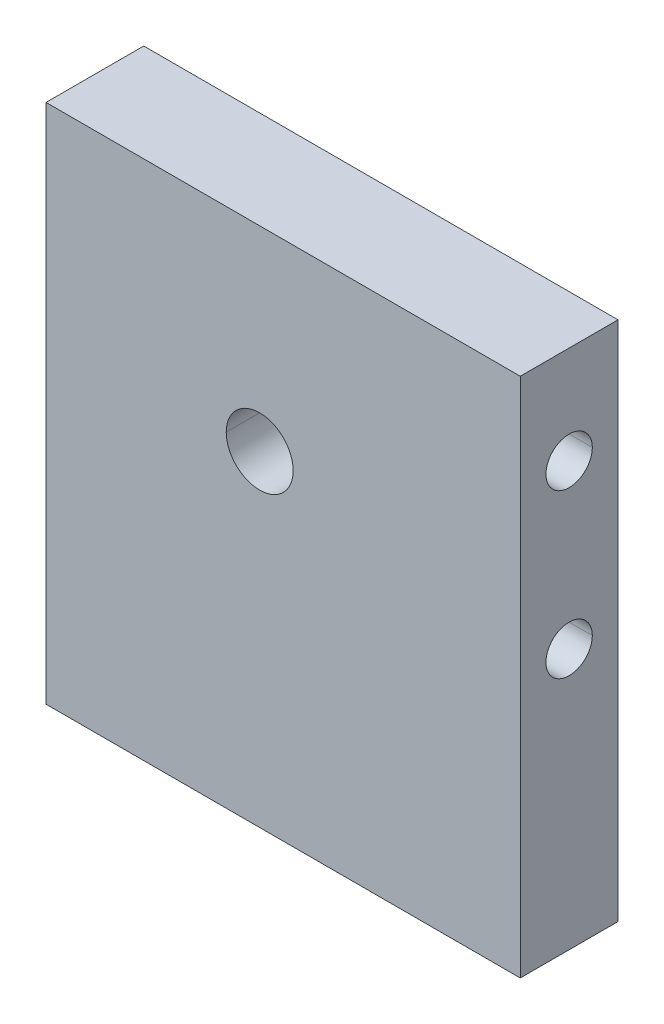
ISO-10303-21;
HEADER;
FILE_DESCRIPTION(('STEP AP214'),'2;1');
FILE_NAME('part.step','',(''),(''),'','','');
FILE_SCHEMA(('AUTOMOTIVE_DESIGN { 1 0 10303 214 1 1 1 1 }'));
ENDSEC;
DATA;
#1=APPLICATION_CONTEXT('core data for automotive mechanical design processes');
#2=APPLICATION_PROTOCOL_DEFINITION('international standard','automotive_design',2000,#1);
#3=PRODUCT_CONTEXT('',#1,'mechanical');
#4=PRODUCT('Part','Part','',(#3));
#5=PRODUCT_RELATED_PRODUCT_CATEGORY('part','',(#4));
#6=PRODUCT_DEFINITION_FORMATION('','',#4);
#7=PRODUCT_DEFINITION_CONTEXT('part definition',#1,'design');
#8=PRODUCT_DEFINITION('design','',#6,#7);
#9=PRODUCT_DEFINITION_SHAPE('','',#8);
#10=(LENGTH_UNIT() NAMED_UNIT(*) SI_UNIT(.MILLI.,.METRE.));
#11=(NAMED_UNIT(*) PLANE_ANGLE_UNIT() SI_UNIT($,.RADIAN.));
#12=(NAMED_UNIT(*) SI_UNIT($,.STERADIAN.) SOLID_ANGLE_UNIT());
#13=UNCERTAINTY_MEASURE_WITH_UNIT(LENGTH_MEASURE(1.E-05),#10,'distance_accuracy_value','');
#14=(GEOMETRIC_REPRESENTATION_CONTEXT(3) GLOBAL_UNCERTAINTY_ASSIGNED_CONTEXT((#13)) GLOBAL_UNIT_ASSIGNED_CONTEXT((#10,
#11,#12)) REPRESENTATION_CONTEXT('',''));
#15=CARTESIAN_POINT('',(0.,0.,0.));
#16=DIRECTION('',(0.,0.,1.));
#17=DIRECTION('',(1.,0.,0.));
#18=AXIS2_PLACEMENT_3D('',#15,#16,#17);
#19=CARTESIAN_POINT('',(11.557,20.6375,2.38125));
#20=DIRECTION('',(1.,0.,0.));
#21=DIRECTION('',(0.,0.,-1.));
#22=AXIS2_PLACEMENT_3D('',#19,#20,#21);
#23=CYLINDRICAL_SURFACE('',#22,1.1303);
#24=CARTESIAN_POINT('',(2.032,20.6375,2.38125));
#25=DIRECTION('',(1.,0.,0.));
#26=DIRECTION('',(0.,0.,-1.));
#27=AXIS2_PLACEMENT_3D('',#24,#25,#26);
#28=CIRCLE('',#27,1.1303);
#29=CARTESIAN_POINT('',(2.032,20.6375,3.51155));
#30=VERTEX_POINT('',#29);
#31=CARTESIAN_POINT('',(2.032,20.6375,1.25095));
#32=VERTEX_POINT('',#31);
#33=EDGE_CURVE('E42',#30,#32,#28,.T.);
#34=ORIENTED_EDGE('',*,*,#33,.F.);
#35=DIRECTION('',(1.,0.,0.));
#36=VECTOR('',#35,1.);
#37=CARTESIAN_POINT('',(11.557,20.6375,3.51155));
#38=LINE('',#37,#36);
#39=CARTESIAN_POINT('',(11.557,20.6375,3.51155));
#40=VERTEX_POINT('',#39);
#41=EDGE_CURVE('E11',#30,#40,#38,.T.);
#42=ORIENTED_EDGE('',*,*,#41,.T.);
#43=CARTESIAN_POINT('',(11.557,20.6375,2.38125));
#44=DIRECTION('',(1.,0.,0.));
#45=DIRECTION('',(0.,0.,-1.));
#46=AXIS2_PLACEMENT_3D('',#43,#44,#45);
#47=CIRCLE('',#46,1.1303);
#48=CARTESIAN_POINT('',(11.557,20.6375,1.25095));
#49=VERTEX_POINT('',#48);
#50=EDGE_CURVE('E28',#40,#49,#47,.T.);
#51=ORIENTED_EDGE('',*,*,#50,.T.);
#52=DIRECTION('',(1.,0.,0.));
#53=VECTOR('',#52,1.);
#54=CARTESIAN_POINT('',(11.557,20.6375,1.25095));
#55=LINE('',#54,#53);
#56=EDGE_CURVE('E158',#32,#49,#55,.T.);
#57=ORIENTED_EDGE('',*,*,#56,.F.);
#58=EDGE_LOOP('',(#34,#42,#51,#57));
#59=FACE_BOUND('',#58,.T.);
#60=ADVANCED_FACE('F17',(#59),#23,.F.);
#61=CARTESIAN_POINT('',(2.032,20.6375,2.38125));
#62=DIRECTION('',(1.,0.,0.));
#63=DIRECTION('',(0.,0.,-1.));
#64=AXIS2_PLACEMENT_3D('',#61,#62,#63);
#65=CONICAL_SURFACE('',#64,1.1303,1.02974425867665);
#66=DIRECTION('',(0.515038074910056,0.,-0.857167300702111));
#67=VECTOR('',#66,1.);
#68=CARTESIAN_POINT('',(2.032,20.6375,1.25095));
#69=LINE('',#68,#67);
#70=CARTESIAN_POINT('',(1.35284724231315,20.6375,2.38125));
#71=VERTEX_POINT('',#70);
#72=EDGE_CURVE('E144',#71,#32,#69,.T.);
#73=ORIENTED_EDGE('',*,*,#72,.F.);
#74=DIRECTION('',(0.515038074910056,0.,0.857167300702111));
#75=VECTOR('',#74,1.);
#76=CARTESIAN_POINT('',(2.032,20.6375,3.51155));
#77=LINE('',#76,#75);
#78=EDGE_CURVE('E168',#71,#30,#77,.T.);
#79=ORIENTED_EDGE('',*,*,#78,.T.);
#80=ORIENTED_EDGE('',*,*,#33,.T.);
#81=EDGE_LOOP('',(#73,#79,#80));
#82=FACE_BOUND('',#81,.T.);
#83=ADVANCED_FACE('F220',(#82),#65,.F.);
#84=CARTESIAN_POINT('',(11.557,12.7,2.38125));
#85=DIRECTION('',(1.,0.,0.));
#86=DIRECTION('',(0.,0.,-1.));
#87=AXIS2_PLACEMENT_3D('',#84,#85,#86);
#88=CYLINDRICAL_SURFACE('',#87,1.1303);
#89=CARTESIAN_POINT('',(2.032,12.7,2.38125));
#90=DIRECTION('',(1.,0.,0.));
#91=DIRECTION('',(0.,0.,-1.));
#92=AXIS2_PLACEMENT_3D('',#89,#90,#91);
#93=CIRCLE('',#92,1.1303);
#94=CARTESIAN_POINT('',(2.032,12.7,3.51155));
#95=VERTEX_POINT('',#94);
#96=CARTESIAN_POINT('',(2.032,12.7,1.25095));
#97=VERTEX_POINT('',#96);
#98=EDGE_CURVE('E120',#95,#97,#93,.T.);
#99=ORIENTED_EDGE('',*,*,#98,.F.);
#100=DIRECTION('',(1.,0.,0.));
#101=VECTOR('',#100,1.);
#102=CARTESIAN_POINT('',(11.557,12.7,3.51155));
#103=LINE('',#102,#101);
#104=CARTESIAN_POINT('',(11.557,12.7,3.51155));
#105=VERTEX_POINT('',#104);
#106=EDGE_CURVE('E136',#95,#105,#103,.T.);
#107=ORIENTED_EDGE('',*,*,#106,.T.);
#108=CARTESIAN_POINT('',(11.557,12.7,2.38125));
#109=DIRECTION('',(1.,0.,0.));
#110=DIRECTION('',(0.,0.,-1.));
#111=AXIS2_PLACEMENT_3D('',#108,#109,#110);
#112=CIRCLE('',#111,1.1303);
#113=CARTESIAN_POINT('',(11.557,12.7,1.25095));
#114=VERTEX_POINT('',#113);
#115=EDGE_CURVE('E130',#105,#114,#112,.T.);
#116=ORIENTED_EDGE('',*,*,#115,.T.);
#117=DIRECTION('',(1.,0.,0.));
#118=VECTOR('',#117,1.);
#119=CARTESIAN_POINT('',(11.557,12.7,1.25095));
#120=LINE('',#119,#118);
#121=EDGE_CURVE('E105',#97,#114,#120,.T.);
#122=ORIENTED_EDGE('',*,*,#121,.F.);
#123=EDGE_LOOP('',(#99,#107,#116,#122));
#124=FACE_BOUND('',#123,.T.);
#125=ADVANCED_FACE('F247',(#124),#88,.F.);
#126=CARTESIAN_POINT('',(2.032,12.7,2.38125));
#127=DIRECTION('',(1.,0.,0.));
#128=DIRECTION('',(0.,0.,-1.));
#129=AXIS2_PLACEMENT_3D('',#126,#127,#128);
#130=CONICAL_SURFACE('',#129,1.1303,1.02974425867665);
#131=DIRECTION('',(0.515038074910056,0.,-0.857167300702111));
#132=VECTOR('',#131,1.);
#133=CARTESIAN_POINT('',(2.032,12.7,1.25095));
#134=LINE('',#133,#132);
#135=CARTESIAN_POINT('',(1.35284724231315,12.7,2.38125));
#136=VERTEX_POINT('',#135);
#137=EDGE_CURVE('E115',#136,#97,#134,.T.);
#138=ORIENTED_EDGE('',*,*,#137,.F.);
#139=DIRECTION('',(0.515038074910056,0.,0.857167300702111));
#140=VECTOR('',#139,1.);
#141=CARTESIAN_POINT('',(2.032,12.7,3.51155));
#142=LINE('',#141,#140);
#143=EDGE_CURVE('E118',#136,#95,#142,.T.);
#144=ORIENTED_EDGE('',*,*,#143,.T.);
#145=ORIENTED_EDGE('',*,*,#98,.T.);
#146=EDGE_LOOP('',(#138,#144,#145));
#147=FACE_BOUND('',#146,.T.);
#148=ADVANCED_FACE('F117',(#147),#130,.F.);
#149=CARTESIAN_POINT('',(-1.14299999999998,15.875,0.));
#150=DIRECTION('',(0.,0.,-1.));
#151=DIRECTION('',(-1.,0.,0.));
#152=AXIS2_PLACEMENT_3D('',#149,#150,#151);
#153=CYLINDRICAL_SURFACE('',#152,1.63195);
#154=CARTESIAN_POINT('',(-1.14299999999998,15.875,4.7625));
#155=DIRECTION('',(0.,0.,-1.));
#156=DIRECTION('',(-1.,0.,0.));
#157=AXIS2_PLACEMENT_3D('',#154,#155,#156);
#158=CIRCLE('',#157,1.63195);
#159=CARTESIAN_POINT('',(0.488950000000019,15.875,4.7625));
#160=VERTEX_POINT('',#159);
#161=CARTESIAN_POINT('',(-2.77495,15.875,4.7625));
#162=VERTEX_POINT('',#161);
#163=EDGE_CURVE('E175',#160,#162,#158,.T.);
#164=ORIENTED_EDGE('',*,*,#163,.F.);
#165=DIRECTION('',(0.,0.,-1.));
#166=VECTOR('',#165,1.);
#167=CARTESIAN_POINT('',(0.488950000000018,15.875,0.));
#168=LINE('',#167,#166);
#169=CARTESIAN_POINT('',(0.488950000000016,15.875,0.));
#170=VERTEX_POINT('',#169);
#171=EDGE_CURVE('E139',#160,#170,#168,.T.);
#172=ORIENTED_EDGE('',*,*,#171,.T.);
#173=CARTESIAN_POINT('',(-1.14299999999998,15.875,0.));
#174=DIRECTION('',(0.,0.,-1.));
#175=DIRECTION('',(-1.,0.,0.));
#176=AXIS2_PLACEMENT_3D('',#173,#174,#175);
#177=CIRCLE('',#176,1.63195);
#178=CARTESIAN_POINT('',(-2.77495,15.875,0.));
#179=VERTEX_POINT('',#178);
#180=EDGE_CURVE('E186',#170,#179,#177,.T.);
#181=ORIENTED_EDGE('',*,*,#180,.T.);
#182=DIRECTION('',(0.,0.,-1.));
#183=VECTOR('',#182,1.);
#184=CARTESIAN_POINT('',(-2.77495,15.875,0.));
#185=LINE('',#184,#183);
#186=EDGE_CURVE('E180',#162,#179,#185,.T.);
#187=ORIENTED_EDGE('',*,*,#186,.F.);
#188=EDGE_LOOP('',(#164,#172,#181,#187));
#189=FACE_BOUND('',#188,.T.);
#190=ADVANCED_FACE('F255',(#189),#153,.F.);
#191=CARTESIAN_POINT('',(-11.557,0.,4.7625));
#192=DIRECTION('',(1.,0.,0.));
#193=DIRECTION('',(0.,-1.,0.));
#194=AXIS2_PLACEMENT_3D('',#191,#192,#193);
#195=PLANE('',#194);
#196=DIRECTION('',(0.,-1.,0.));
#197=VECTOR('',#196,1.);
#198=CARTESIAN_POINT('',(-11.557,0.,0.));
#199=LINE('',#198,#197);
#200=CARTESIAN_POINT('',(-11.557,25.4,0.));
#201=VERTEX_POINT('',#200);
#202=CARTESIAN_POINT('',(-11.557,0.,0.));
#203=VERTEX_POINT('',#202);
#204=EDGE_CURVE('E173',#201,#203,#199,.T.);
#205=ORIENTED_EDGE('',*,*,#204,.T.);
#206=DIRECTION('',(0.,0.,-1.));
#207=VECTOR('',#206,1.);
#208=CARTESIAN_POINT('',(-11.557,0.,4.7625));
#209=LINE('',#208,#207);
#210=CARTESIAN_POINT('',(-11.557,0.,4.7625));
#211=VERTEX_POINT('',#210);
#212=EDGE_CURVE('E207',#211,#203,#209,.T.);
#213=ORIENTED_EDGE('',*,*,#212,.F.);
#214=DIRECTION('',(0.,-1.,0.));
#215=VECTOR('',#214,1.);
#216=CARTESIAN_POINT('',(-11.557,0.,4.7625));
#217=LINE('',#216,#215);
#218=CARTESIAN_POINT('',(-11.557,25.4,4.7625));
#219=VERTEX_POINT('',#218);
#220=EDGE_CURVE('E150',#219,#211,#217,.T.);
#221=ORIENTED_EDGE('',*,*,#220,.F.);
#222=DIRECTION('',(0.,0.,-1.));
#223=VECTOR('',#222,1.);
#224=CARTESIAN_POINT('',(-11.557,25.4,4.7625));
#225=LINE('',#224,#223);
#226=EDGE_CURVE('E170',#219,#201,#225,.T.);
#227=ORIENTED_EDGE('',*,*,#226,.T.);
#228=EDGE_LOOP('',(#205,#213,#221,#227));
#229=FACE_BOUND('',#228,.T.);
#230=ADVANCED_FACE('F330',(#229),#195,.F.);
#231=CARTESIAN_POINT('',(-11.557,0.,4.7625));
#232=DIRECTION('',(0.,1.,0.));
#233=DIRECTION('',(1.,0.,0.));
#234=AXIS2_PLACEMENT_3D('',#231,#232,#233);
#235=PLANE('',#234);
#236=DIRECTION('',(1.,0.,0.));
#237=VECTOR('',#236,1.);
#238=CARTESIAN_POINT('',(-11.557,0.,0.));
#239=LINE('',#238,#237);
#240=CARTESIAN_POINT('',(11.557,0.,0.));
#241=VERTEX_POINT('',#240);
#242=EDGE_CURVE('E174',#203,#241,#239,.T.);
#243=ORIENTED_EDGE('',*,*,#242,.T.);
#244=DIRECTION('',(0.,0.,-1.));
#245=VECTOR('',#244,1.);
#246=CARTESIAN_POINT('',(11.557,0.,4.7625));
#247=LINE('',#246,#245);
#248=CARTESIAN_POINT('',(11.557,0.,4.7625));
#249=VERTEX_POINT('',#248);
#250=EDGE_CURVE('E282',#249,#241,#247,.T.);
#251=ORIENTED_EDGE('',*,*,#250,.F.);
#252=DIRECTION('',(1.,0.,0.));
#253=VECTOR('',#252,1.);
#254=CARTESIAN_POINT('',(-11.557,0.,4.7625));
#255=LINE('',#254,#253);
#256=EDGE_CURVE('E21',#211,#249,#255,.T.);
#257=ORIENTED_EDGE('',*,*,#256,.F.);
#258=ORIENTED_EDGE('',*,*,#212,.T.);
#259=EDGE_LOOP('',(#243,#251,#257,#258));
#260=FACE_BOUND('',#259,.T.);
#261=ADVANCED_FACE('F250',(#260),#235,.F.);
#262=CARTESIAN_POINT('',(11.557,0.,4.7625));
#263=DIRECTION('',(-1.,0.,0.));
#264=DIRECTION('',(0.,0.,1.));
#265=AXIS2_PLACEMENT_3D('',#262,#263,#264);
#266=PLANE('',#265);
#267=DIRECTION('',(0.,1.,0.));
#268=VECTOR('',#267,1.);
#269=CARTESIAN_POINT('',(11.557,0.,0.));
#270=LINE('',#269,#268);
#271=CARTESIAN_POINT('',(11.557,25.4,0.));
#272=VERTEX_POINT('',#271);
#273=EDGE_CURVE('E210',#241,#272,#270,.T.);
#274=ORIENTED_EDGE('',*,*,#273,.T.);
#275=DIRECTION('',(0.,0.,-1.));
#276=VECTOR('',#275,1.);
#277=CARTESIAN_POINT('',(11.557,25.4,4.7625));
#278=LINE('',#277,#276);
#279=CARTESIAN_POINT('',(11.557,25.4,4.7625));
#280=VERTEX_POINT('',#279);
#281=EDGE_CURVE('E154',#280,#272,#278,.T.);
#282=ORIENTED_EDGE('',*,*,#281,.F.);
#283=DIRECTION('',(0.,1.,0.));
#284=VECTOR('',#283,1.);
#285=CARTESIAN_POINT('',(11.557,0.,4.7625));
#286=LINE('',#285,#284);
#287=EDGE_CURVE('E185',#249,#280,#286,.T.);
#288=ORIENTED_EDGE('',*,*,#287,.F.);
#289=ORIENTED_EDGE('',*,*,#250,.T.);
#290=EDGE_LOOP('',(#274,#282,#288,#289));
#291=FACE_BOUND('',#290,.T.);
#292=CARTESIAN_POINT('',(11.557,20.6375,2.38125));
#293=DIRECTION('',(1.,0.,0.));
#294=DIRECTION('',(0.,0.,-1.));
#295=AXIS2_PLACEMENT_3D('',#292,#293,#294);
#296=CIRCLE('',#295,1.1303);
#297=EDGE_CURVE('E162',#49,#40,#296,.T.);
#298=ORIENTED_EDGE('',*,*,#297,.F.);
#299=ORIENTED_EDGE('',*,*,#50,.F.);
#300=EDGE_LOOP('',(#298,#299));
#301=FACE_BOUND('',#300,.T.);
#302=CARTESIAN_POINT('',(11.557,12.7,2.38125));
#303=DIRECTION('',(1.,0.,0.));
#304=DIRECTION('',(0.,0.,-1.));
#305=AXIS2_PLACEMENT_3D('',#302,#303,#304);
#306=CIRCLE('',#305,1.1303);
#307=EDGE_CURVE('E148',#114,#105,#306,.T.);
#308=ORIENTED_EDGE('',*,*,#307,.F.);
#309=ORIENTED_EDGE('',*,*,#115,.F.);
#310=EDGE_LOOP('',(#308,#309));
#311=FACE_BOUND('',#310,.T.);
#312=ADVANCED_FACE('F262',(#291,#301,#311),#266,.F.);
#313=CARTESIAN_POINT('',(-11.557,25.4,4.7625));
#314=DIRECTION('',(0.,-1.,0.));
#315=DIRECTION('',(0.,0.,-1.));
#316=AXIS2_PLACEMENT_3D('',#313,#314,#315);
#317=PLANE('',#316);
#318=DIRECTION('',(-1.,0.,0.));
#319=VECTOR('',#318,1.);
#320=CARTESIAN_POINT('',(-11.557,25.4,0.));
#321=LINE('',#320,#319);
#322=EDGE_CURVE('E165',#272,#201,#321,.T.);
#323=ORIENTED_EDGE('',*,*,#322,.T.);
#324=ORIENTED_EDGE('',*,*,#226,.F.);
#325=DIRECTION('',(-1.,0.,0.));
#326=VECTOR('',#325,1.);
#327=CARTESIAN_POINT('',(-11.557,25.4,4.7625));
#328=LINE('',#327,#326);
#329=EDGE_CURVE('E181',#280,#219,#328,.T.);
#330=ORIENTED_EDGE('',*,*,#329,.F.);
#331=ORIENTED_EDGE('',*,*,#281,.T.);
#332=EDGE_LOOP('',(#323,#324,#330,#331));
#333=FACE_BOUND('',#332,.T.);
#334=ADVANCED_FACE('F264',(#333),#317,.F.);
#335=CARTESIAN_POINT('',(0.,0.,4.7625));
#336=DIRECTION('',(0.,0.,-1.));
#337=DIRECTION('',(0.,-1.,0.));
#338=AXIS2_PLACEMENT_3D('',#335,#336,#337);
#339=PLANE('',#338);
#340=ORIENTED_EDGE('',*,*,#220,.T.);
#341=ORIENTED_EDGE('',*,*,#256,.T.);
#342=ORIENTED_EDGE('',*,*,#287,.T.);
#343=ORIENTED_EDGE('',*,*,#329,.T.);
#344=EDGE_LOOP('',(#340,#341,#342,#343));
#345=FACE_BOUND('',#344,.T.);
#346=CARTESIAN_POINT('',(-1.14299999999998,15.875,4.7625));
#347=DIRECTION('',(0.,0.,-1.));
#348=DIRECTION('',(-1.,0.,0.));
#349=AXIS2_PLACEMENT_3D('',#346,#347,#348);
#350=CIRCLE('',#349,1.63195);
#351=EDGE_CURVE('E179',#162,#160,#350,.T.);
#352=ORIENTED_EDGE('',*,*,#351,.T.);
#353=ORIENTED_EDGE('',*,*,#163,.T.);
#354=EDGE_LOOP('',(#352,#353));
#355=FACE_BOUND('',#354,.T.);
#356=ADVANCED_FACE('F260',(#345,#355),#339,.F.);
#357=CARTESIAN_POINT('',(0.,0.,0.));
#358=DIRECTION('',(0.,0.,-1.));
#359=DIRECTION('',(0.,-1.,0.));
#360=AXIS2_PLACEMENT_3D('',#357,#358,#359);
#361=PLANE('',#360);
#362=ORIENTED_EDGE('',*,*,#204,.F.);
#363=ORIENTED_EDGE('',*,*,#322,.F.);
#364=ORIENTED_EDGE('',*,*,#273,.F.);
#365=ORIENTED_EDGE('',*,*,#242,.F.);
#366=EDGE_LOOP('',(#362,#363,#364,#365));
#367=FACE_BOUND('',#366,.T.);
#368=CARTESIAN_POINT('',(-1.14299999999998,15.875,0.));
#369=DIRECTION('',(0.,0.,-1.));
#370=DIRECTION('',(-1.,0.,0.));
#371=AXIS2_PLACEMENT_3D('',#368,#369,#370);
#372=CIRCLE('',#371,1.63195);
#373=EDGE_CURVE('E125',#179,#170,#372,.T.);
#374=ORIENTED_EDGE('',*,*,#373,.F.);
#375=ORIENTED_EDGE('',*,*,#180,.F.);
#376=EDGE_LOOP('',(#374,#375));
#377=FACE_BOUND('',#376,.T.);
#378=ADVANCED_FACE('F256',(#367,#377),#361,.T.);
#379=CARTESIAN_POINT('',(-1.14299999999998,15.875,0.));
#380=DIRECTION('',(0.,0.,-1.));
#381=DIRECTION('',(-1.,0.,0.));
#382=AXIS2_PLACEMENT_3D('',#379,#380,#381);
#383=CYLINDRICAL_SURFACE('',#382,1.63195);
#384=ORIENTED_EDGE('',*,*,#171,.F.);
#385=ORIENTED_EDGE('',*,*,#351,.F.);
#386=ORIENTED_EDGE('',*,*,#186,.T.);
#387=ORIENTED_EDGE('',*,*,#373,.T.);
#388=EDGE_LOOP('',(#384,#385,#386,#387));
#389=FACE_BOUND('',#388,.T.);
#390=ADVANCED_FACE('F259',(#389),#383,.F.);
#391=CARTESIAN_POINT('',(2.032,12.7,2.38125));
#392=DIRECTION('',(1.,0.,0.));
#393=DIRECTION('',(0.,0.,-1.));
#394=AXIS2_PLACEMENT_3D('',#391,#392,#393);
#395=CONICAL_SURFACE('',#394,1.1303,1.02974425867665);
#396=ORIENTED_EDGE('',*,*,#143,.F.);
#397=ORIENTED_EDGE('',*,*,#137,.T.);
#398=CARTESIAN_POINT('',(2.032,12.7,2.38125));
#399=DIRECTION('',(1.,0.,0.));
#400=DIRECTION('',(0.,0.,-1.));
#401=AXIS2_PLACEMENT_3D('',#398,#399,#400);
#402=CIRCLE('',#401,1.1303);
#403=EDGE_CURVE('E126',#97,#95,#402,.T.);
#404=ORIENTED_EDGE('',*,*,#403,.T.);
#405=EDGE_LOOP('',(#396,#397,#404));
#406=FACE_BOUND('',#405,.T.);
#407=ADVANCED_FACE('F128',(#406),#395,.F.);
#408=CARTESIAN_POINT('',(11.557,12.7,2.38125));
#409=DIRECTION('',(1.,0.,0.));
#410=DIRECTION('',(0.,0.,-1.));
#411=AXIS2_PLACEMENT_3D('',#408,#409,#410);
#412=CYLINDRICAL_SURFACE('',#411,1.1303);
#413=ORIENTED_EDGE('',*,*,#106,.F.);
#414=ORIENTED_EDGE('',*,*,#403,.F.);
#415=ORIENTED_EDGE('',*,*,#121,.T.);
#416=ORIENTED_EDGE('',*,*,#307,.T.);
#417=EDGE_LOOP('',(#413,#414,#415,#416));
#418=FACE_BOUND('',#417,.T.);
#419=ADVANCED_FACE('F19',(#418),#412,.F.);
#420=CARTESIAN_POINT('',(2.032,20.6375,2.38125));
#421=DIRECTION('',(1.,0.,0.));
#422=DIRECTION('',(0.,0.,-1.));
#423=AXIS2_PLACEMENT_3D('',#420,#421,#422);
#424=CONICAL_SURFACE('',#423,1.1303,1.02974425867665);
#425=ORIENTED_EDGE('',*,*,#78,.F.);
#426=ORIENTED_EDGE('',*,*,#72,.T.);
#427=CARTESIAN_POINT('',(2.032,20.6375,2.38125));
#428=DIRECTION('',(1.,0.,0.));
#429=DIRECTION('',(0.,0.,-1.));
#430=AXIS2_PLACEMENT_3D('',#427,#428,#429);
#431=CIRCLE('',#430,1.1303);
#432=EDGE_CURVE('E149',#32,#30,#431,.T.);
#433=ORIENTED_EDGE('',*,*,#432,.T.);
#434=EDGE_LOOP('',(#425,#426,#433));
#435=FACE_BOUND('',#434,.T.);
#436=ADVANCED_FACE('F229',(#435),#424,.F.);
#437=CARTESIAN_POINT('',(11.557,20.6375,2.38125));
#438=DIRECTION('',(1.,0.,0.));
#439=DIRECTION('',(0.,0.,-1.));
#440=AXIS2_PLACEMENT_3D('',#437,#438,#439);
#441=CYLINDRICAL_SURFACE('',#440,1.1303);
#442=ORIENTED_EDGE('',*,*,#41,.F.);
#443=ORIENTED_EDGE('',*,*,#432,.F.);
#444=ORIENTED_EDGE('',*,*,#56,.T.);
#445=ORIENTED_EDGE('',*,*,#297,.T.);
#446=EDGE_LOOP('',(#442,#443,#444,#445));
#447=FACE_BOUND('',#446,.T.);
#448=ADVANCED_FACE('F226',(#447),#441,.F.);
#449=CLOSED_SHELL('',(#60,#83,#125,#148,#190,#230,#261,#312,#334,#356,#378,#390,#407,#419,#436,#448));
#450=MANIFOLD_SOLID_BREP('B1',#449);
#451=ADVANCED_BREP_SHAPE_REPRESENTATION('',(#18,#450),#14);
#452=SHAPE_DEFINITION_REPRESENTATION(#9,#451);
ENDSEC;
END-ISO-10303-21;
